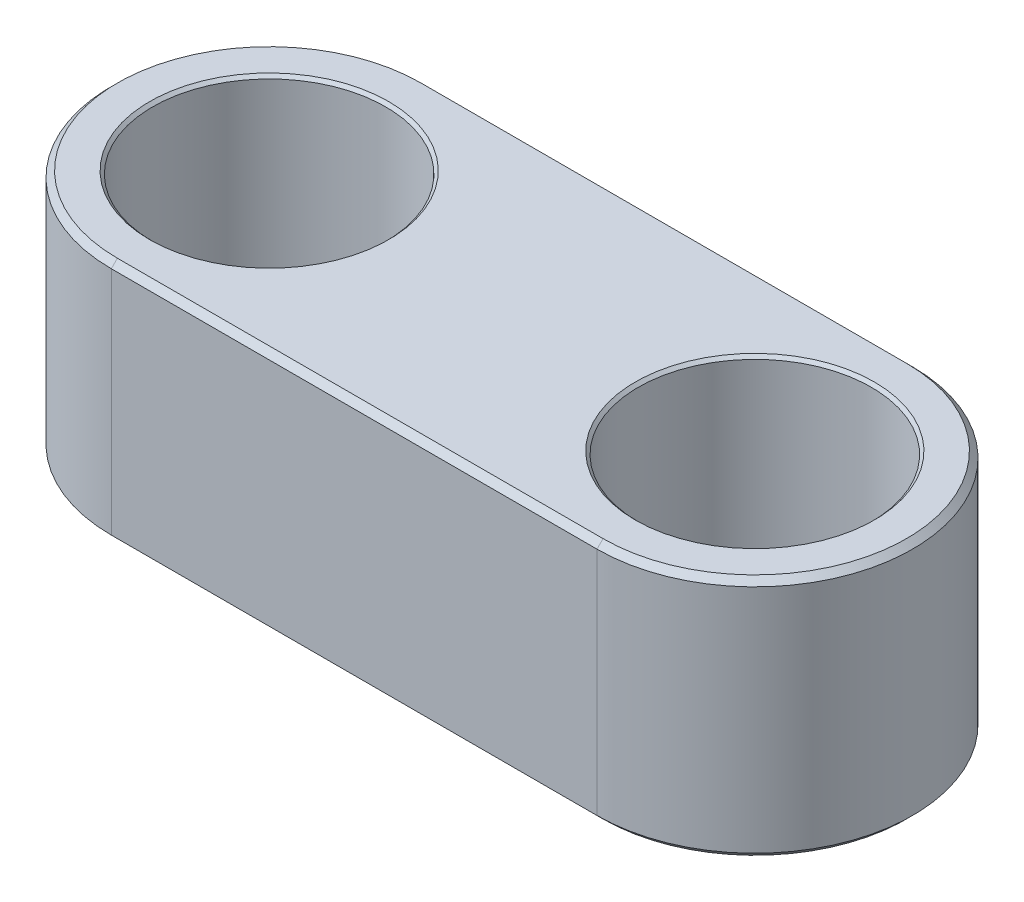
ISO-10303-21;
HEADER;
FILE_DESCRIPTION(('STEP AP214'),'2;1');
FILE_NAME('part.step','',(''),(''),'','','');
FILE_SCHEMA(('AUTOMOTIVE_DESIGN { 1 0 10303 214 1 1 1 1 }'));
ENDSEC;
DATA;
#1=APPLICATION_CONTEXT('core data for automotive mechanical design processes');
#2=APPLICATION_PROTOCOL_DEFINITION('international standard','automotive_design',2000,#1);
#3=PRODUCT_CONTEXT('',#1,'mechanical');
#4=PRODUCT('Part','Part','',(#3));
#5=PRODUCT_RELATED_PRODUCT_CATEGORY('part','',(#4));
#6=PRODUCT_DEFINITION_FORMATION('','',#4);
#7=PRODUCT_DEFINITION_CONTEXT('part definition',#1,'design');
#8=PRODUCT_DEFINITION('design','',#6,#7);
#9=PRODUCT_DEFINITION_SHAPE('','',#8);
#10=(LENGTH_UNIT() NAMED_UNIT(*) SI_UNIT(.MILLI.,.METRE.));
#11=(NAMED_UNIT(*) PLANE_ANGLE_UNIT() SI_UNIT($,.RADIAN.));
#12=(NAMED_UNIT(*) SI_UNIT($,.STERADIAN.) SOLID_ANGLE_UNIT());
#13=UNCERTAINTY_MEASURE_WITH_UNIT(LENGTH_MEASURE(1.E-05),#10,'distance_accuracy_value','');
#14=(GEOMETRIC_REPRESENTATION_CONTEXT(3) GLOBAL_UNCERTAINTY_ASSIGNED_CONTEXT((#13)) GLOBAL_UNIT_ASSIGNED_CONTEXT((#10,
#11,#12)) REPRESENTATION_CONTEXT('',''));
#15=CARTESIAN_POINT('',(0.,0.,0.));
#16=DIRECTION('',(0.,0.,1.));
#17=DIRECTION('',(1.,0.,0.));
#18=AXIS2_PLACEMENT_3D('',#15,#16,#17);
#19=CARTESIAN_POINT('',(0.,40.,0.));
#20=DIRECTION('',(0.,1.,0.));
#21=DIRECTION('',(0.,0.,1.));
#22=AXIS2_PLACEMENT_3D('',#19,#20,#21);
#23=PLANE('',#22);
#24=CARTESIAN_POINT('',(80.,40.,0.));
#25=DIRECTION('',(0.,1.,0.));
#26=DIRECTION('',(0.,0.,1.));
#27=AXIS2_PLACEMENT_3D('',#24,#25,#26);
#28=CIRCLE('',#27,19.7);
#29=CARTESIAN_POINT('',(80.,40.,19.7));
#30=VERTEX_POINT('',#29);
#31=EDGE_CURVE('E370',#30,#30,#28,.F.);
#32=ORIENTED_EDGE('',*,*,#31,.T.);
#33=EDGE_LOOP('',(#32));
#34=FACE_BOUND('',#33,.T.);
#35=CARTESIAN_POINT('',(0.,40.,0.));
#36=DIRECTION('',(0.,1.,0.));
#37=DIRECTION('',(0.,0.,1.));
#38=AXIS2_PLACEMENT_3D('',#35,#36,#37);
#39=CIRCLE('',#38,19.7);
#40=CARTESIAN_POINT('',(0.,40.,19.7));
#41=VERTEX_POINT('',#40);
#42=EDGE_CURVE('E367',#41,#41,#39,.F.);
#43=ORIENTED_EDGE('',*,*,#42,.T.);
#44=EDGE_LOOP('',(#43));
#45=FACE_BOUND('',#44,.T.);
#46=DIRECTION('',(-1.,0.,0.));
#47=VECTOR('',#46,1.);
#48=CARTESIAN_POINT('',(0.,40.,-25.));
#49=LINE('',#48,#47);
#50=CARTESIAN_POINT('',(80.,40.,-25.));
#51=VERTEX_POINT('',#50);
#52=CARTESIAN_POINT('',(0.,40.,-25.));
#53=VERTEX_POINT('',#52);
#54=EDGE_CURVE('E295',#51,#53,#49,.T.);
#55=ORIENTED_EDGE('',*,*,#54,.T.);
#56=CARTESIAN_POINT('',(0.,40.,0.));
#57=DIRECTION('',(0.,1.,0.));
#58=DIRECTION('',(0.,0.,1.));
#59=AXIS2_PLACEMENT_3D('',#56,#57,#58);
#60=CIRCLE('',#59,25.);
#61=CARTESIAN_POINT('',(0.,40.,25.));
#62=VERTEX_POINT('',#61);
#63=EDGE_CURVE('E291',#53,#62,#60,.T.);
#64=ORIENTED_EDGE('',*,*,#63,.T.);
#65=DIRECTION('',(1.,0.,0.));
#66=VECTOR('',#65,1.);
#67=CARTESIAN_POINT('',(80.,40.,25.));
#68=LINE('',#67,#66);
#69=CARTESIAN_POINT('',(80.,40.,25.));
#70=VERTEX_POINT('',#69);
#71=EDGE_CURVE('E293',#62,#70,#68,.T.);
#72=ORIENTED_EDGE('',*,*,#71,.T.);
#73=CARTESIAN_POINT('',(80.,40.,0.));
#74=DIRECTION('',(0.,1.,0.));
#75=DIRECTION('',(0.,0.,1.));
#76=AXIS2_PLACEMENT_3D('',#73,#74,#75);
#77=CIRCLE('',#76,25.);
#78=EDGE_CURVE('E297',#70,#51,#77,.T.);
#79=ORIENTED_EDGE('',*,*,#78,.T.);
#80=EDGE_LOOP('',(#55,#64,#72,#79));
#81=FACE_BOUND('',#80,.T.);
#82=ADVANCED_FACE('F36',(#34,#45,#81),#23,.T.);
#83=CARTESIAN_POINT('',(0.,0.,0.));
#84=DIRECTION('',(0.,1.,0.));
#85=DIRECTION('',(0.,0.,1.));
#86=AXIS2_PLACEMENT_3D('',#83,#84,#85);
#87=PLANE('',#86);
#88=CARTESIAN_POINT('',(80.,0.,0.));
#89=DIRECTION('',(0.,1.,0.));
#90=DIRECTION('',(0.,0.,1.));
#91=AXIS2_PLACEMENT_3D('',#88,#89,#90);
#92=CIRCLE('',#91,19.7);
#93=CARTESIAN_POINT('',(80.,0.,19.7));
#94=VERTEX_POINT('',#93);
#95=EDGE_CURVE('E376',#94,#94,#92,.T.);
#96=ORIENTED_EDGE('',*,*,#95,.T.);
#97=EDGE_LOOP('',(#96));
#98=FACE_BOUND('',#97,.T.);
#99=CARTESIAN_POINT('',(0.,0.,0.));
#100=DIRECTION('',(0.,1.,0.));
#101=DIRECTION('',(0.,0.,1.));
#102=AXIS2_PLACEMENT_3D('',#99,#100,#101);
#103=CIRCLE('',#102,19.7);
#104=CARTESIAN_POINT('',(0.,0.,19.7));
#105=VERTEX_POINT('',#104);
#106=EDGE_CURVE('E373',#105,#105,#103,.T.);
#107=ORIENTED_EDGE('',*,*,#106,.T.);
#108=EDGE_LOOP('',(#107));
#109=FACE_BOUND('',#108,.T.);
#110=DIRECTION('',(1.,0.,0.));
#111=VECTOR('',#110,1.);
#112=CARTESIAN_POINT('',(0.,0.,-25.));
#113=LINE('',#112,#111);
#114=CARTESIAN_POINT('',(0.,0.,-25.));
#115=VERTEX_POINT('',#114);
#116=CARTESIAN_POINT('',(80.,0.,-25.));
#117=VERTEX_POINT('',#116);
#118=EDGE_CURVE('E276',#115,#117,#113,.T.);
#119=ORIENTED_EDGE('',*,*,#118,.T.);
#120=CARTESIAN_POINT('',(80.,0.,0.));
#121=DIRECTION('',(0.,1.,0.));
#122=DIRECTION('',(0.,0.,1.));
#123=AXIS2_PLACEMENT_3D('',#120,#121,#122);
#124=CIRCLE('',#123,25.);
#125=CARTESIAN_POINT('',(80.,0.,25.));
#126=VERTEX_POINT('',#125);
#127=EDGE_CURVE('E272',#117,#126,#124,.F.);
#128=ORIENTED_EDGE('',*,*,#127,.T.);
#129=DIRECTION('',(-1.,0.,0.));
#130=VECTOR('',#129,1.);
#131=CARTESIAN_POINT('',(0.,0.,25.));
#132=LINE('',#131,#130);
#133=CARTESIAN_POINT('',(0.,0.,25.));
#134=VERTEX_POINT('',#133);
#135=EDGE_CURVE('E270',#126,#134,#132,.T.);
#136=ORIENTED_EDGE('',*,*,#135,.T.);
#137=CARTESIAN_POINT('',(0.,0.,0.));
#138=DIRECTION('',(0.,1.,0.));
#139=DIRECTION('',(0.,0.,1.));
#140=AXIS2_PLACEMENT_3D('',#137,#138,#139);
#141=CIRCLE('',#140,25.);
#142=EDGE_CURVE('E274',#134,#115,#141,.F.);
#143=ORIENTED_EDGE('',*,*,#142,.T.);
#144=EDGE_LOOP('',(#119,#128,#136,#143));
#145=FACE_BOUND('',#144,.T.);
#146=ADVANCED_FACE('F394',(#98,#109,#145),#87,.F.);
#147=CARTESIAN_POINT('',(0.,40.,0.));
#148=DIRECTION('',(0.,-1.,0.));
#149=DIRECTION('',(0.,0.,-1.));
#150=AXIS2_PLACEMENT_3D('',#147,#148,#149);
#151=CYLINDRICAL_SURFACE('',#150,26.);
#152=DIRECTION('',(0.,-1.,0.));
#153=VECTOR('',#152,1.);
#154=CARTESIAN_POINT('',(0.,40.,-26.));
#155=LINE('',#154,#153);
#156=CARTESIAN_POINT('',(0.,39.,-26.));
#157=VERTEX_POINT('',#156);
#158=CARTESIAN_POINT('',(0.,1.,-26.));
#159=VERTEX_POINT('',#158);
#160=EDGE_CURVE('E254',#157,#159,#155,.T.);
#161=ORIENTED_EDGE('',*,*,#160,.T.);
#162=CARTESIAN_POINT('',(0.,1.,0.));
#163=DIRECTION('',(0.,1.,0.));
#164=DIRECTION('',(0.,0.,1.));
#165=AXIS2_PLACEMENT_3D('',#162,#163,#164);
#166=CIRCLE('',#165,26.);
#167=CARTESIAN_POINT('',(0.,1.,26.));
#168=VERTEX_POINT('',#167);
#169=EDGE_CURVE('E280',#159,#168,#166,.T.);
#170=ORIENTED_EDGE('',*,*,#169,.T.);
#171=DIRECTION('',(0.,-1.,0.));
#172=VECTOR('',#171,1.);
#173=CARTESIAN_POINT('',(0.,40.,26.));
#174=LINE('',#173,#172);
#175=CARTESIAN_POINT('',(0.,39.,26.));
#176=VERTEX_POINT('',#175);
#177=EDGE_CURVE('E263',#176,#168,#174,.T.);
#178=ORIENTED_EDGE('',*,*,#177,.F.);
#179=CARTESIAN_POINT('',(0.,39.,0.));
#180=DIRECTION('',(0.,1.,0.));
#181=DIRECTION('',(0.,0.,1.));
#182=AXIS2_PLACEMENT_3D('',#179,#180,#181);
#183=CIRCLE('',#182,26.);
#184=EDGE_CURVE('E278',#176,#157,#183,.F.);
#185=ORIENTED_EDGE('',*,*,#184,.T.);
#186=EDGE_LOOP('',(#161,#170,#178,#185));
#187=FACE_BOUND('',#186,.T.);
#188=ADVANCED_FACE('F400',(#187),#151,.T.);
#189=CARTESIAN_POINT('',(0.,40.,26.));
#190=DIRECTION('',(0.,0.,-1.));
#191=DIRECTION('',(-1.,0.,0.));
#192=AXIS2_PLACEMENT_3D('',#189,#190,#191);
#193=PLANE('',#192);
#194=DIRECTION('',(-1.,0.,0.));
#195=VECTOR('',#194,1.);
#196=CARTESIAN_POINT('',(0.,39.,26.));
#197=LINE('',#196,#195);
#198=CARTESIAN_POINT('',(80.,39.,26.));
#199=VERTEX_POINT('',#198);
#200=EDGE_CURVE('E287',#199,#176,#197,.T.);
#201=ORIENTED_EDGE('',*,*,#200,.T.);
#202=ORIENTED_EDGE('',*,*,#177,.T.);
#203=DIRECTION('',(1.,0.,0.));
#204=VECTOR('',#203,1.);
#205=CARTESIAN_POINT('',(0.,1.,26.));
#206=LINE('',#205,#204);
#207=CARTESIAN_POINT('',(80.,1.,26.));
#208=VERTEX_POINT('',#207);
#209=EDGE_CURVE('E289',#168,#208,#206,.T.);
#210=ORIENTED_EDGE('',*,*,#209,.T.);
#211=DIRECTION('',(0.,-1.,0.));
#212=VECTOR('',#211,1.);
#213=CARTESIAN_POINT('',(80.,40.,26.));
#214=LINE('',#213,#212);
#215=EDGE_CURVE('E260',#199,#208,#214,.T.);
#216=ORIENTED_EDGE('',*,*,#215,.F.);
#217=EDGE_LOOP('',(#201,#202,#210,#216));
#218=FACE_BOUND('',#217,.T.);
#219=ADVANCED_FACE('F414',(#218),#193,.F.);
#220=CARTESIAN_POINT('',(80.,40.,0.));
#221=DIRECTION('',(0.,-1.,0.));
#222=DIRECTION('',(0.,0.,-1.));
#223=AXIS2_PLACEMENT_3D('',#220,#221,#222);
#224=CYLINDRICAL_SURFACE('',#223,26.);
#225=ORIENTED_EDGE('',*,*,#215,.T.);
#226=CARTESIAN_POINT('',(80.,1.,0.));
#227=DIRECTION('',(0.,1.,0.));
#228=DIRECTION('',(0.,0.,1.));
#229=AXIS2_PLACEMENT_3D('',#226,#227,#228);
#230=CIRCLE('',#229,26.);
#231=CARTESIAN_POINT('',(80.,1.,-26.));
#232=VERTEX_POINT('',#231);
#233=EDGE_CURVE('E285',#208,#232,#230,.T.);
#234=ORIENTED_EDGE('',*,*,#233,.T.);
#235=DIRECTION('',(0.,-1.,0.));
#236=VECTOR('',#235,1.);
#237=CARTESIAN_POINT('',(80.,40.,-26.));
#238=LINE('',#237,#236);
#239=CARTESIAN_POINT('',(80.,39.,-26.));
#240=VERTEX_POINT('',#239);
#241=EDGE_CURVE('E257',#240,#232,#238,.T.);
#242=ORIENTED_EDGE('',*,*,#241,.F.);
#243=CARTESIAN_POINT('',(80.,39.,0.));
#244=DIRECTION('',(0.,1.,0.));
#245=DIRECTION('',(0.,0.,1.));
#246=AXIS2_PLACEMENT_3D('',#243,#244,#245);
#247=CIRCLE('',#246,26.);
#248=EDGE_CURVE('E282',#240,#199,#247,.F.);
#249=ORIENTED_EDGE('',*,*,#248,.T.);
#250=EDGE_LOOP('',(#225,#234,#242,#249));
#251=FACE_BOUND('',#250,.T.);
#252=ADVANCED_FACE('F410',(#251),#224,.T.);
#253=CARTESIAN_POINT('',(0.,40.,-26.));
#254=DIRECTION('',(0.,0.,1.));
#255=DIRECTION('',(1.,0.,0.));
#256=AXIS2_PLACEMENT_3D('',#253,#254,#255);
#257=PLANE('',#256);
#258=DIRECTION('',(1.,0.,0.));
#259=VECTOR('',#258,1.);
#260=CARTESIAN_POINT('',(80.,39.,-26.));
#261=LINE('',#260,#259);
#262=EDGE_CURVE('E266',#157,#240,#261,.T.);
#263=ORIENTED_EDGE('',*,*,#262,.T.);
#264=ORIENTED_EDGE('',*,*,#241,.T.);
#265=DIRECTION('',(-1.,0.,0.));
#266=VECTOR('',#265,1.);
#267=CARTESIAN_POINT('',(0.,1.,-26.));
#268=LINE('',#267,#266);
#269=EDGE_CURVE('E268',#232,#159,#268,.T.);
#270=ORIENTED_EDGE('',*,*,#269,.T.);
#271=ORIENTED_EDGE('',*,*,#160,.F.);
#272=EDGE_LOOP('',(#263,#264,#270,#271));
#273=FACE_BOUND('',#272,.T.);
#274=ADVANCED_FACE('F407',(#273),#257,.F.);
#275=CARTESIAN_POINT('',(0.,40.,0.));
#276=DIRECTION('',(0.,-1.,0.));
#277=DIRECTION('',(0.,0.,-1.));
#278=AXIS2_PLACEMENT_3D('',#275,#276,#277);
#279=CYLINDRICAL_SURFACE('',#278,19.2);
#280=CARTESIAN_POINT('',(0.,0.500000000000007,0.));
#281=DIRECTION('',(0.,1.,0.));
#282=DIRECTION('',(0.,0.,1.));
#283=AXIS2_PLACEMENT_3D('',#280,#281,#282);
#284=CIRCLE('',#283,19.2);
#285=CARTESIAN_POINT('',(0.,0.500000000000007,19.2));
#286=VERTEX_POINT('',#285);
#287=EDGE_CURVE('E11',#286,#286,#284,.F.);
#288=ORIENTED_EDGE('',*,*,#287,.T.);
#289=EDGE_LOOP('',(#288));
#290=FACE_BOUND('',#289,.T.);
#291=CARTESIAN_POINT('',(0.,39.5,0.));
#292=DIRECTION('',(0.,1.,0.));
#293=DIRECTION('',(0.,0.,1.));
#294=AXIS2_PLACEMENT_3D('',#291,#292,#293);
#295=CIRCLE('',#294,19.2);
#296=CARTESIAN_POINT('',(0.,39.5,19.2));
#297=VERTEX_POINT('',#296);
#298=EDGE_CURVE('E46',#297,#297,#295,.T.);
#299=ORIENTED_EDGE('',*,*,#298,.T.);
#300=EDGE_LOOP('',(#299));
#301=FACE_BOUND('',#300,.T.);
#302=ADVANCED_FACE('F381',(#290,#301),#279,.F.);
#303=CARTESIAN_POINT('',(80.,40.,0.));
#304=DIRECTION('',(0.,-1.,0.));
#305=DIRECTION('',(0.,0.,-1.));
#306=AXIS2_PLACEMENT_3D('',#303,#304,#305);
#307=CYLINDRICAL_SURFACE('',#306,19.2);
#308=CARTESIAN_POINT('',(80.,39.5,0.));
#309=DIRECTION('',(0.,1.,0.));
#310=DIRECTION('',(0.,0.,1.));
#311=AXIS2_PLACEMENT_3D('',#308,#309,#310);
#312=CIRCLE('',#311,19.2);
#313=CARTESIAN_POINT('',(80.,39.5,19.2));
#314=VERTEX_POINT('',#313);
#315=EDGE_CURVE('E364',#314,#314,#312,.T.);
#316=ORIENTED_EDGE('',*,*,#315,.T.);
#317=EDGE_LOOP('',(#316));
#318=FACE_BOUND('',#317,.T.);
#319=CARTESIAN_POINT('',(80.,0.499999999999987,0.));
#320=DIRECTION('',(0.,1.,0.));
#321=DIRECTION('',(0.,0.,1.));
#322=AXIS2_PLACEMENT_3D('',#319,#320,#321);
#323=CIRCLE('',#322,19.2);
#324=CARTESIAN_POINT('',(80.,0.499999999999987,19.2));
#325=VERTEX_POINT('',#324);
#326=EDGE_CURVE('E361',#325,#325,#323,.F.);
#327=ORIENTED_EDGE('',*,*,#326,.T.);
#328=EDGE_LOOP('',(#327));
#329=FACE_BOUND('',#328,.T.);
#330=ADVANCED_FACE('F451',(#318,#329),#307,.F.);
#331=CARTESIAN_POINT('',(0.,1.,26.));
#332=DIRECTION('',(0.,0.707106781186547,-0.707106781186547));
#333=DIRECTION('',(1.,0.,0.));
#334=AXIS2_PLACEMENT_3D('',#331,#332,#333);
#335=PLANE('',#334);
#336=DIRECTION('',(0.,-0.707106781186547,-0.707106781186547));
#337=VECTOR('',#336,1.);
#338=CARTESIAN_POINT('',(80.,1.,26.));
#339=LINE('',#338,#337);
#340=EDGE_CURVE('E253',#208,#126,#339,.T.);
#341=ORIENTED_EDGE('',*,*,#340,.F.);
#342=ORIENTED_EDGE('',*,*,#209,.F.);
#343=DIRECTION('',(0.,0.707106781186547,0.707106781186547));
#344=VECTOR('',#343,1.);
#345=CARTESIAN_POINT('',(0.,0.,25.));
#346=LINE('',#345,#344);
#347=EDGE_CURVE('E308',#134,#168,#346,.T.);
#348=ORIENTED_EDGE('',*,*,#347,.F.);
#349=ORIENTED_EDGE('',*,*,#135,.F.);
#350=EDGE_LOOP('',(#341,#342,#348,#349));
#351=FACE_BOUND('',#350,.T.);
#352=ADVANCED_FACE('F445',(#351),#335,.F.);
#353=CARTESIAN_POINT('',(80.,1.,0.));
#354=DIRECTION('',(0.,1.,0.));
#355=DIRECTION('',(0.,0.,1.));
#356=AXIS2_PLACEMENT_3D('',#353,#354,#355);
#357=CONICAL_SURFACE('',#356,26.,0.785398163397448);
#358=ORIENTED_EDGE('',*,*,#340,.T.);
#359=ORIENTED_EDGE('',*,*,#127,.F.);
#360=DIRECTION('',(0.,-0.707106781186547,0.707106781186547));
#361=VECTOR('',#360,1.);
#362=CARTESIAN_POINT('',(80.,1.,-26.));
#363=LINE('',#362,#361);
#364=EDGE_CURVE('E304',#232,#117,#363,.T.);
#365=ORIENTED_EDGE('',*,*,#364,.F.);
#366=ORIENTED_EDGE('',*,*,#233,.F.);
#367=EDGE_LOOP('',(#358,#359,#365,#366));
#368=FACE_BOUND('',#367,.T.);
#369=ADVANCED_FACE('F438',(#368),#357,.T.);
#370=CARTESIAN_POINT('',(0.,1.,0.));
#371=DIRECTION('',(0.,1.,0.));
#372=DIRECTION('',(0.,0.,1.));
#373=AXIS2_PLACEMENT_3D('',#370,#371,#372);
#374=CONICAL_SURFACE('',#373,26.,0.785398163397448);
#375=ORIENTED_EDGE('',*,*,#347,.T.);
#376=ORIENTED_EDGE('',*,*,#169,.F.);
#377=DIRECTION('',(0.,0.707106781186547,-0.707106781186547));
#378=VECTOR('',#377,1.);
#379=CARTESIAN_POINT('',(0.,0.,-25.));
#380=LINE('',#379,#378);
#381=EDGE_CURVE('E301',#115,#159,#380,.T.);
#382=ORIENTED_EDGE('',*,*,#381,.F.);
#383=ORIENTED_EDGE('',*,*,#142,.F.);
#384=EDGE_LOOP('',(#375,#376,#382,#383));
#385=FACE_BOUND('',#384,.T.);
#386=ADVANCED_FACE('F431',(#385),#374,.T.);
#387=CARTESIAN_POINT('',(0.,1.,-26.));
#388=DIRECTION('',(0.,0.707106781186547,0.707106781186547));
#389=DIRECTION('',(-1.,0.,0.));
#390=AXIS2_PLACEMENT_3D('',#387,#388,#389);
#391=PLANE('',#390);
#392=ORIENTED_EDGE('',*,*,#381,.T.);
#393=ORIENTED_EDGE('',*,*,#269,.F.);
#394=ORIENTED_EDGE('',*,*,#364,.T.);
#395=ORIENTED_EDGE('',*,*,#118,.F.);
#396=EDGE_LOOP('',(#392,#393,#394,#395));
#397=FACE_BOUND('',#396,.T.);
#398=ADVANCED_FACE('F423',(#397),#391,.F.);
#399=CARTESIAN_POINT('',(0.,40.,0.));
#400=DIRECTION('',(0.,-1.,0.));
#401=DIRECTION('',(0.,0.,-1.));
#402=AXIS2_PLACEMENT_3D('',#399,#400,#401);
#403=CONICAL_SURFACE('',#402,25.,0.785398163397447);
#404=DIRECTION('',(0.,0.707106781186549,0.707106781186546));
#405=VECTOR('',#404,1.);
#406=CARTESIAN_POINT('',(0.,39.,-26.));
#407=LINE('',#406,#405);
#408=EDGE_CURVE('E316',#157,#53,#407,.T.);
#409=ORIENTED_EDGE('',*,*,#408,.F.);
#410=ORIENTED_EDGE('',*,*,#184,.F.);
#411=DIRECTION('',(0.,-0.707106781186549,0.707106781186546));
#412=VECTOR('',#411,1.);
#413=CARTESIAN_POINT('',(0.,40.,25.));
#414=LINE('',#413,#412);
#415=EDGE_CURVE('E305',#62,#176,#414,.T.);
#416=ORIENTED_EDGE('',*,*,#415,.F.);
#417=ORIENTED_EDGE('',*,*,#63,.F.);
#418=EDGE_LOOP('',(#409,#410,#416,#417));
#419=FACE_BOUND('',#418,.T.);
#420=ADVANCED_FACE('F430',(#419),#403,.T.);
#421=CARTESIAN_POINT('',(0.,40.,25.));
#422=DIRECTION('',(0.,0.707106781186546,0.707106781186549));
#423=DIRECTION('',(-1.,0.,0.));
#424=AXIS2_PLACEMENT_3D('',#421,#422,#423);
#425=PLANE('',#424);
#426=DIRECTION('',(0.,-0.707106781186549,0.707106781186546));
#427=VECTOR('',#426,1.);
#428=CARTESIAN_POINT('',(80.,40.,25.));
#429=LINE('',#428,#427);
#430=EDGE_CURVE('E314',#70,#199,#429,.T.);
#431=ORIENTED_EDGE('',*,*,#430,.F.);
#432=ORIENTED_EDGE('',*,*,#71,.F.);
#433=ORIENTED_EDGE('',*,*,#415,.T.);
#434=ORIENTED_EDGE('',*,*,#200,.F.);
#435=EDGE_LOOP('',(#431,#432,#433,#434));
#436=FACE_BOUND('',#435,.T.);
#437=ADVANCED_FACE('F469',(#436),#425,.T.);
#438=CARTESIAN_POINT('',(0.,40.,-25.));
#439=DIRECTION('',(0.,0.707106781186546,-0.707106781186549));
#440=DIRECTION('',(1.,0.,0.));
#441=AXIS2_PLACEMENT_3D('',#438,#439,#440);
#442=PLANE('',#441);
#443=ORIENTED_EDGE('',*,*,#408,.T.);
#444=ORIENTED_EDGE('',*,*,#54,.F.);
#445=DIRECTION('',(0.,0.707106781186549,0.707106781186546));
#446=VECTOR('',#445,1.);
#447=CARTESIAN_POINT('',(80.,39.,-26.));
#448=LINE('',#447,#446);
#449=EDGE_CURVE('E239',#240,#51,#448,.T.);
#450=ORIENTED_EDGE('',*,*,#449,.F.);
#451=ORIENTED_EDGE('',*,*,#262,.F.);
#452=EDGE_LOOP('',(#443,#444,#450,#451));
#453=FACE_BOUND('',#452,.T.);
#454=ADVANCED_FACE('F462',(#453),#442,.T.);
#455=CARTESIAN_POINT('',(80.,40.,0.));
#456=DIRECTION('',(0.,-1.,0.));
#457=DIRECTION('',(0.,0.,-1.));
#458=AXIS2_PLACEMENT_3D('',#455,#456,#457);
#459=CONICAL_SURFACE('',#458,25.,0.785398163397447);
#460=ORIENTED_EDGE('',*,*,#430,.T.);
#461=ORIENTED_EDGE('',*,*,#248,.F.);
#462=ORIENTED_EDGE('',*,*,#449,.T.);
#463=ORIENTED_EDGE('',*,*,#78,.F.);
#464=EDGE_LOOP('',(#460,#461,#462,#463));
#465=FACE_BOUND('',#464,.T.);
#466=ADVANCED_FACE('F454',(#465),#459,.T.);
#467=CARTESIAN_POINT('',(80.,39.5,0.));
#468=DIRECTION('',(0.,1.,0.));
#469=DIRECTION('',(0.,0.,1.));
#470=AXIS2_PLACEMENT_3D('',#467,#468,#469);
#471=CONICAL_SURFACE('',#470,19.2,0.785398163397445);
#472=ORIENTED_EDGE('',*,*,#31,.F.);
#473=EDGE_LOOP('',(#472));
#474=FACE_BOUND('',#473,.T.);
#475=ORIENTED_EDGE('',*,*,#315,.F.);
#476=EDGE_LOOP('',(#475));
#477=FACE_BOUND('',#476,.T.);
#478=ADVANCED_FACE('F461',(#474,#477),#471,.F.);
#479=CARTESIAN_POINT('',(80.,0.,0.));
#480=DIRECTION('',(0.,-1.,0.));
#481=DIRECTION('',(0.,0.,-1.));
#482=AXIS2_PLACEMENT_3D('',#479,#480,#481);
#483=CONICAL_SURFACE('',#482,19.7,0.785398163397452);
#484=ORIENTED_EDGE('',*,*,#326,.F.);
#485=EDGE_LOOP('',(#484));
#486=FACE_BOUND('',#485,.T.);
#487=ORIENTED_EDGE('',*,*,#95,.F.);
#488=EDGE_LOOP('',(#487));
#489=FACE_BOUND('',#488,.T.);
#490=ADVANCED_FACE('F390',(#486,#489),#483,.F.);
#491=CARTESIAN_POINT('',(0.,0.,0.));
#492=DIRECTION('',(0.,-1.,0.));
#493=DIRECTION('',(0.,0.,-1.));
#494=AXIS2_PLACEMENT_3D('',#491,#492,#493);
#495=CONICAL_SURFACE('',#494,19.7,0.785398163397438);
#496=ORIENTED_EDGE('',*,*,#287,.F.);
#497=EDGE_LOOP('',(#496));
#498=FACE_BOUND('',#497,.T.);
#499=ORIENTED_EDGE('',*,*,#106,.F.);
#500=EDGE_LOOP('',(#499));
#501=FACE_BOUND('',#500,.T.);
#502=ADVANCED_FACE('F384',(#498,#501),#495,.F.);
#503=CARTESIAN_POINT('',(0.,39.5,0.));
#504=DIRECTION('',(0.,1.,0.));
#505=DIRECTION('',(0.,0.,1.));
#506=AXIS2_PLACEMENT_3D('',#503,#504,#505);
#507=CONICAL_SURFACE('',#506,19.2,0.785398163397445);
#508=ORIENTED_EDGE('',*,*,#42,.F.);
#509=EDGE_LOOP('',(#508));
#510=FACE_BOUND('',#509,.T.);
#511=ORIENTED_EDGE('',*,*,#298,.F.);
#512=EDGE_LOOP('',(#511));
#513=FACE_BOUND('',#512,.T.);
#514=ADVANCED_FACE('F39',(#510,#513),#507,.F.);
#515=CLOSED_SHELL('',(#82,#146,#188,#219,#252,#274,#302,#330,#352,#369,#386,#398,#420,#437,#454,
#466,#478,#490,#502,#514));
#516=CARTESIAN_POINT('',(80.,37.,0.));
#517=DIRECTION('',(0.,1.,0.));
#518=DIRECTION('',(0.,0.,1.));
#519=AXIS2_PLACEMENT_3D('',#516,#517,#518);
#520=PLANE('',#519);
#521=DIRECTION('',(0.,0.,-1.));
#522=VECTOR('',#521,1.);
#523=CARTESIAN_POINT('',(37.,37.,-15.5520682838068));
#524=LINE('',#523,#522);
#525=CARTESIAN_POINT('',(37.,37.,19.));
#526=VERTEX_POINT('',#525);
#527=CARTESIAN_POINT('',(37.,37.,-19.));
#528=VERTEX_POINT('',#527);
#529=EDGE_CURVE('E229',#526,#528,#524,.T.);
#530=ORIENTED_EDGE('',*,*,#529,.F.);
#531=CARTESIAN_POINT('',(36.,37.,19.));
#532=DIRECTION('',(0.,1.,0.));
#533=DIRECTION('',(0.,0.,1.));
#534=AXIS2_PLACEMENT_3D('',#531,#532,#533);
#535=CIRCLE('',#534,1.);
#536=CARTESIAN_POINT('',(36.,37.,20.));
#537=VERTEX_POINT('',#536);
#538=EDGE_CURVE('E231',#526,#537,#535,.F.);
#539=ORIENTED_EDGE('',*,*,#538,.T.);
#540=DIRECTION('',(1.,0.,0.));
#541=VECTOR('',#540,1.);
#542=CARTESIAN_POINT('',(18.0399556540475,37.,20.));
#543=LINE('',#542,#541);
#544=CARTESIAN_POINT('',(18.0399556540475,37.,20.));
#545=VERTEX_POINT('',#544);
#546=EDGE_CURVE('E222',#545,#537,#543,.T.);
#547=ORIENTED_EDGE('',*,*,#546,.F.);
#548=CARTESIAN_POINT('',(18.0399556540475,37.,19.));
#549=DIRECTION('',(0.,1.,0.));
#550=DIRECTION('',(0.,0.,1.));
#551=AXIS2_PLACEMENT_3D('',#548,#549,#550);
#552=CIRCLE('',#551,1.);
#553=CARTESIAN_POINT('',(17.3514077283205,37.,18.2748091603053));
#554=VERTEX_POINT('',#553);
#555=EDGE_CURVE('E219',#554,#545,#552,.T.);
#556=ORIENTED_EDGE('',*,*,#555,.F.);
#557=CARTESIAN_POINT('',(0.,37.,0.));
#558=DIRECTION('',(0.,-1.,0.));
#559=DIRECTION('',(0.,0.,1.));
#560=AXIS2_PLACEMENT_3D('',#557,#558,#559);
#561=CIRCLE('',#560,25.2);
#562=CARTESIAN_POINT('',(17.3514077283205,37.,-18.2748091603053));
#563=VERTEX_POINT('',#562);
#564=EDGE_CURVE('E217',#563,#554,#561,.T.);
#565=ORIENTED_EDGE('',*,*,#564,.F.);
#566=CARTESIAN_POINT('',(18.0399556540475,37.,-19.));
#567=DIRECTION('',(0.,1.,0.));
#568=DIRECTION('',(0.,0.,1.));
#569=AXIS2_PLACEMENT_3D('',#566,#567,#568);
#570=CIRCLE('',#569,1.);
#571=CARTESIAN_POINT('',(18.0399556540475,37.,-20.));
#572=VERTEX_POINT('',#571);
#573=EDGE_CURVE('E215',#572,#563,#570,.T.);
#574=ORIENTED_EDGE('',*,*,#573,.F.);
#575=DIRECTION('',(-1.,0.,0.));
#576=VECTOR('',#575,1.);
#577=CARTESIAN_POINT('',(18.0399556540475,37.,-20.));
#578=LINE('',#577,#576);
#579=CARTESIAN_POINT('',(36.,37.,-20.));
#580=VERTEX_POINT('',#579);
#581=EDGE_CURVE('E210',#580,#572,#578,.T.);
#582=ORIENTED_EDGE('',*,*,#581,.F.);
#583=CARTESIAN_POINT('',(36.,37.,-19.));
#584=DIRECTION('',(0.,1.,0.));
#585=DIRECTION('',(0.,0.,1.));
#586=AXIS2_PLACEMENT_3D('',#583,#584,#585);
#587=CIRCLE('',#586,1.);
#588=EDGE_CURVE('E226',#580,#528,#587,.F.);
#589=ORIENTED_EDGE('',*,*,#588,.T.);
#590=EDGE_LOOP('',(#530,#539,#547,#556,#565,#574,#582,#589));
#591=FACE_BOUND('',#590,.T.);
#592=ADVANCED_FACE('F588',(#591),#520,.F.);
#593=CARTESIAN_POINT('',(0.,6.,0.));
#594=DIRECTION('',(0.,1.,0.));
#595=DIRECTION('',(0.,0.,1.));
#596=AXIS2_PLACEMENT_3D('',#593,#594,#595);
#597=PLANE('',#596);
#598=DIRECTION('',(1.,0.,0.));
#599=VECTOR('',#598,1.);
#600=CARTESIAN_POINT('',(0.,6.,20.));
#601=LINE('',#600,#599);
#602=CARTESIAN_POINT('',(18.0399556540475,6.,20.));
#603=VERTEX_POINT('',#602);
#604=CARTESIAN_POINT('',(36.,6.,20.));
#605=VERTEX_POINT('',#604);
#606=EDGE_CURVE('E244',#603,#605,#601,.T.);
#607=ORIENTED_EDGE('',*,*,#606,.T.);
#608=CARTESIAN_POINT('',(36.,6.,19.));
#609=DIRECTION('',(0.,1.,0.));
#610=DIRECTION('',(0.,0.,1.));
#611=AXIS2_PLACEMENT_3D('',#608,#609,#610);
#612=CIRCLE('',#611,1.);
#613=CARTESIAN_POINT('',(37.,6.,19.));
#614=VERTEX_POINT('',#613);
#615=EDGE_CURVE('E344',#605,#614,#612,.T.);
#616=ORIENTED_EDGE('',*,*,#615,.T.);
#617=DIRECTION('',(0.,0.,-1.));
#618=VECTOR('',#617,1.);
#619=CARTESIAN_POINT('',(37.,6.,0.));
#620=LINE('',#619,#618);
#621=CARTESIAN_POINT('',(37.,6.,-19.));
#622=VERTEX_POINT('',#621);
#623=EDGE_CURVE('E300',#614,#622,#620,.T.);
#624=ORIENTED_EDGE('',*,*,#623,.T.);
#625=CARTESIAN_POINT('',(36.,6.,-19.));
#626=DIRECTION('',(0.,1.,0.));
#627=DIRECTION('',(0.,0.,1.));
#628=AXIS2_PLACEMENT_3D('',#625,#626,#627);
#629=CIRCLE('',#628,1.);
#630=CARTESIAN_POINT('',(36.,6.,-20.));
#631=VERTEX_POINT('',#630);
#632=EDGE_CURVE('E342',#622,#631,#629,.T.);
#633=ORIENTED_EDGE('',*,*,#632,.T.);
#634=DIRECTION('',(-1.,0.,0.));
#635=VECTOR('',#634,1.);
#636=CARTESIAN_POINT('',(0.,6.,-20.));
#637=LINE('',#636,#635);
#638=CARTESIAN_POINT('',(18.0399556540475,6.,-20.));
#639=VERTEX_POINT('',#638);
#640=EDGE_CURVE('E240',#631,#639,#637,.T.);
#641=ORIENTED_EDGE('',*,*,#640,.T.);
#642=CARTESIAN_POINT('',(18.0399556540475,6.,-19.));
#643=DIRECTION('',(0.,1.,0.));
#644=DIRECTION('',(0.,0.,1.));
#645=AXIS2_PLACEMENT_3D('',#642,#643,#644);
#646=CIRCLE('',#645,1.);
#647=CARTESIAN_POINT('',(17.3514077283205,6.,-18.2748091603053));
#648=VERTEX_POINT('',#647);
#649=EDGE_CURVE('E338',#639,#648,#646,.T.);
#650=ORIENTED_EDGE('',*,*,#649,.T.);
#651=CARTESIAN_POINT('',(0.,6.,0.));
#652=DIRECTION('',(0.,1.,0.));
#653=DIRECTION('',(0.,0.,1.));
#654=AXIS2_PLACEMENT_3D('',#651,#652,#653);
#655=CIRCLE('',#654,25.2);
#656=CARTESIAN_POINT('',(17.3514077283205,6.,18.2748091603053));
#657=VERTEX_POINT('',#656);
#658=EDGE_CURVE('E248',#657,#648,#655,.T.);
#659=ORIENTED_EDGE('',*,*,#658,.F.);
#660=CARTESIAN_POINT('',(18.0399556540475,6.,19.));
#661=DIRECTION('',(0.,1.,0.));
#662=DIRECTION('',(0.,0.,1.));
#663=AXIS2_PLACEMENT_3D('',#660,#661,#662);
#664=CIRCLE('',#663,1.);
#665=EDGE_CURVE('E340',#657,#603,#664,.T.);
#666=ORIENTED_EDGE('',*,*,#665,.T.);
#667=EDGE_LOOP('',(#607,#616,#624,#633,#641,#650,#659,#666));
#668=FACE_BOUND('',#667,.T.);
#669=ADVANCED_FACE('F508',(#668),#597,.T.);
#670=CARTESIAN_POINT('',(18.0399556540475,40.,-19.));
#671=DIRECTION('',(0.,-1.,0.));
#672=DIRECTION('',(0.,0.,-1.));
#673=AXIS2_PLACEMENT_3D('',#670,#671,#672);
#674=CYLINDRICAL_SURFACE('',#673,1.);
#675=ORIENTED_EDGE('',*,*,#573,.T.);
#676=DIRECTION('',(0.,-1.,0.));
#677=VECTOR('',#676,1.);
#678=CARTESIAN_POINT('',(17.3514077283205,40.,-18.2748091603053));
#679=LINE('',#678,#677);
#680=EDGE_CURVE('E356',#648,#563,#679,.F.);
#681=ORIENTED_EDGE('',*,*,#680,.F.);
#682=ORIENTED_EDGE('',*,*,#649,.F.);
#683=DIRECTION('',(0.,-1.,0.));
#684=VECTOR('',#683,1.);
#685=CARTESIAN_POINT('',(18.0399556540475,40.,-20.));
#686=LINE('',#685,#684);
#687=EDGE_CURVE('E351',#572,#639,#686,.T.);
#688=ORIENTED_EDGE('',*,*,#687,.F.);
#689=EDGE_LOOP('',(#675,#681,#682,#688));
#690=FACE_BOUND('',#689,.T.);
#691=ADVANCED_FACE('F504',(#690),#674,.F.);
#692=CARTESIAN_POINT('',(18.0399556540475,40.,19.));
#693=DIRECTION('',(0.,-1.,0.));
#694=DIRECTION('',(0.,0.,-1.));
#695=AXIS2_PLACEMENT_3D('',#692,#693,#694);
#696=CYLINDRICAL_SURFACE('',#695,1.);
#697=ORIENTED_EDGE('',*,*,#555,.T.);
#698=DIRECTION('',(0.,-1.,0.));
#699=VECTOR('',#698,1.);
#700=CARTESIAN_POINT('',(18.0399556540475,40.,20.));
#701=LINE('',#700,#699);
#702=EDGE_CURVE('E333',#603,#545,#701,.F.);
#703=ORIENTED_EDGE('',*,*,#702,.F.);
#704=ORIENTED_EDGE('',*,*,#665,.F.);
#705=DIRECTION('',(0.,-1.,0.));
#706=VECTOR('',#705,1.);
#707=CARTESIAN_POINT('',(17.3514077283205,40.,18.2748091603053));
#708=LINE('',#707,#706);
#709=EDGE_CURVE('E359',#554,#657,#708,.T.);
#710=ORIENTED_EDGE('',*,*,#709,.F.);
#711=EDGE_LOOP('',(#697,#703,#704,#710));
#712=FACE_BOUND('',#711,.T.);
#713=ADVANCED_FACE('F501',(#712),#696,.F.);
#714=CARTESIAN_POINT('',(0.,40.,0.));
#715=DIRECTION('',(0.,-1.,0.));
#716=DIRECTION('',(0.,0.,-1.));
#717=AXIS2_PLACEMENT_3D('',#714,#715,#716);
#718=CYLINDRICAL_SURFACE('',#717,25.2);
#719=ORIENTED_EDGE('',*,*,#564,.T.);
#720=ORIENTED_EDGE('',*,*,#709,.T.);
#721=ORIENTED_EDGE('',*,*,#658,.T.);
#722=ORIENTED_EDGE('',*,*,#680,.T.);
#723=EDGE_LOOP('',(#719,#720,#721,#722));
#724=FACE_BOUND('',#723,.T.);
#725=ADVANCED_FACE('F499',(#724),#718,.T.);
#726=CARTESIAN_POINT('',(36.,40.,-19.));
#727=DIRECTION('',(0.,1.,0.));
#728=DIRECTION('',(0.,0.,1.));
#729=AXIS2_PLACEMENT_3D('',#726,#727,#728);
#730=CYLINDRICAL_SURFACE('',#729,1.);
#731=ORIENTED_EDGE('',*,*,#588,.F.);
#732=DIRECTION('',(0.,-1.,0.));
#733=VECTOR('',#732,1.);
#734=CARTESIAN_POINT('',(36.,40.,-20.));
#735=LINE('',#734,#733);
#736=EDGE_CURVE('E353',#631,#580,#735,.F.);
#737=ORIENTED_EDGE('',*,*,#736,.F.);
#738=ORIENTED_EDGE('',*,*,#632,.F.);
#739=DIRECTION('',(0.,-1.,0.));
#740=VECTOR('',#739,1.);
#741=CARTESIAN_POINT('',(37.,6.,-19.));
#742=LINE('',#741,#740);
#743=EDGE_CURVE('E346',#528,#622,#742,.T.);
#744=ORIENTED_EDGE('',*,*,#743,.F.);
#745=EDGE_LOOP('',(#731,#737,#738,#744));
#746=FACE_BOUND('',#745,.T.);
#747=ADVANCED_FACE('F494',(#746),#730,.F.);
#748=CARTESIAN_POINT('',(36.,40.,19.));
#749=DIRECTION('',(0.,1.,0.));
#750=DIRECTION('',(0.,0.,1.));
#751=AXIS2_PLACEMENT_3D('',#748,#749,#750);
#752=CYLINDRICAL_SURFACE('',#751,1.);
#753=ORIENTED_EDGE('',*,*,#538,.F.);
#754=DIRECTION('',(0.,-1.,0.));
#755=VECTOR('',#754,1.);
#756=CARTESIAN_POINT('',(37.,40.,19.));
#757=LINE('',#756,#755);
#758=EDGE_CURVE('E348',#614,#526,#757,.F.);
#759=ORIENTED_EDGE('',*,*,#758,.F.);
#760=ORIENTED_EDGE('',*,*,#615,.F.);
#761=DIRECTION('',(0.,-1.,0.));
#762=VECTOR('',#761,1.);
#763=CARTESIAN_POINT('',(36.,6.,20.));
#764=LINE('',#763,#762);
#765=EDGE_CURVE('E336',#537,#605,#764,.T.);
#766=ORIENTED_EDGE('',*,*,#765,.F.);
#767=EDGE_LOOP('',(#753,#759,#760,#766));
#768=FACE_BOUND('',#767,.T.);
#769=ADVANCED_FACE('F490',(#768),#752,.F.);
#770=CARTESIAN_POINT('',(37.,40.,-15.5520682838068));
#771=DIRECTION('',(-1.,0.,0.));
#772=DIRECTION('',(0.,0.,1.));
#773=AXIS2_PLACEMENT_3D('',#770,#771,#772);
#774=PLANE('',#773);
#775=ORIENTED_EDGE('',*,*,#758,.T.);
#776=ORIENTED_EDGE('',*,*,#529,.T.);
#777=ORIENTED_EDGE('',*,*,#743,.T.);
#778=ORIENTED_EDGE('',*,*,#623,.F.);
#779=EDGE_LOOP('',(#775,#776,#777,#778));
#780=FACE_BOUND('',#779,.T.);
#781=ADVANCED_FACE('F493',(#780),#774,.T.);
#782=CARTESIAN_POINT('',(0.,40.,-20.));
#783=DIRECTION('',(0.,0.,1.));
#784=DIRECTION('',(1.,0.,0.));
#785=AXIS2_PLACEMENT_3D('',#782,#783,#784);
#786=PLANE('',#785);
#787=ORIENTED_EDGE('',*,*,#736,.T.);
#788=ORIENTED_EDGE('',*,*,#581,.T.);
#789=ORIENTED_EDGE('',*,*,#687,.T.);
#790=ORIENTED_EDGE('',*,*,#640,.F.);
#791=EDGE_LOOP('',(#787,#788,#789,#790));
#792=FACE_BOUND('',#791,.T.);
#793=ADVANCED_FACE('F581',(#792),#786,.T.);
#794=CARTESIAN_POINT('',(0.,40.,20.));
#795=DIRECTION('',(0.,0.,-1.));
#796=DIRECTION('',(-1.,0.,0.));
#797=AXIS2_PLACEMENT_3D('',#794,#795,#796);
#798=PLANE('',#797);
#799=ORIENTED_EDGE('',*,*,#702,.T.);
#800=ORIENTED_EDGE('',*,*,#546,.T.);
#801=ORIENTED_EDGE('',*,*,#765,.T.);
#802=ORIENTED_EDGE('',*,*,#606,.F.);
#803=EDGE_LOOP('',(#799,#800,#801,#802));
#804=FACE_BOUND('',#803,.T.);
#805=ADVANCED_FACE('F582',(#804),#798,.T.);
#806=CLOSED_SHELL('',(#592,#669,#691,#713,#725,#747,#769,#781,#793,#805));
#807=CARTESIAN_POINT('',(43.,37.,20.));
#808=VERTEX_POINT('',#807);
#809=CARTESIAN_POINT('',(61.9600443459525,37.,20.));
#810=VERTEX_POINT('',#809);
#811=EDGE_CURVE('E221',#808,#810,#543,.T.);
#812=ORIENTED_EDGE('',*,*,#811,.F.);
#813=DIRECTION('',(0.,0.,-1.));
#814=VECTOR('',#813,1.);
#815=CARTESIAN_POINT('',(43.,37.,-15.5520682838068));
#816=LINE('',#815,#814);
#817=CARTESIAN_POINT('',(43.,37.,-20.));
#818=VERTEX_POINT('',#817);
#819=EDGE_CURVE('E53',#808,#818,#816,.T.);
#820=ORIENTED_EDGE('',*,*,#819,.T.);
#821=CARTESIAN_POINT('',(61.9600443459525,37.,-20.));
#822=VERTEX_POINT('',#821);
#823=EDGE_CURVE('E61',#822,#818,#578,.T.);
#824=ORIENTED_EDGE('',*,*,#823,.F.);
#825=CARTESIAN_POINT('',(61.9600443459525,37.,-19.));
#826=DIRECTION('',(0.,1.,0.));
#827=DIRECTION('',(0.,0.,1.));
#828=AXIS2_PLACEMENT_3D('',#825,#826,#827);
#829=CIRCLE('',#828,1.);
#830=CARTESIAN_POINT('',(62.6485922716795,37.,-18.2748091603053));
#831=VERTEX_POINT('',#830);
#832=EDGE_CURVE('E192',#831,#822,#829,.T.);
#833=ORIENTED_EDGE('',*,*,#832,.F.);
#834=CARTESIAN_POINT('',(80.,37.,0.));
#835=DIRECTION('',(0.,-1.,0.));
#836=DIRECTION('',(0.,0.,1.));
#837=AXIS2_PLACEMENT_3D('',#834,#835,#836);
#838=CIRCLE('',#837,25.2);
#839=CARTESIAN_POINT('',(62.6485922716795,37.,18.2748091603053));
#840=VERTEX_POINT('',#839);
#841=EDGE_CURVE('E202',#840,#831,#838,.T.);
#842=ORIENTED_EDGE('',*,*,#841,.F.);
#843=CARTESIAN_POINT('',(61.9600443459525,37.,19.));
#844=DIRECTION('',(0.,1.,0.));
#845=DIRECTION('',(0.,0.,1.));
#846=AXIS2_PLACEMENT_3D('',#843,#844,#845);
#847=CIRCLE('',#846,1.);
#848=EDGE_CURVE('E224',#810,#840,#847,.T.);
#849=ORIENTED_EDGE('',*,*,#848,.F.);
#850=EDGE_LOOP('',(#812,#820,#824,#833,#842,#849));
#851=FACE_BOUND('',#850,.T.);
#852=ADVANCED_FACE('F209',(#851),#520,.F.);
#853=CARTESIAN_POINT('',(43.,6.,20.));
#854=VERTEX_POINT('',#853);
#855=CARTESIAN_POINT('',(61.9600443459525,6.,20.));
#856=VERTEX_POINT('',#855);
#857=EDGE_CURVE('E247',#854,#856,#601,.T.);
#858=ORIENTED_EDGE('',*,*,#857,.T.);
#859=CARTESIAN_POINT('',(61.9600443459525,6.,19.));
#860=DIRECTION('',(0.,1.,0.));
#861=DIRECTION('',(0.,0.,1.));
#862=AXIS2_PLACEMENT_3D('',#859,#860,#861);
#863=CIRCLE('',#862,1.);
#864=CARTESIAN_POINT('',(62.6485922716795,6.,18.2748091603053));
#865=VERTEX_POINT('',#864);
#866=EDGE_CURVE('E329',#856,#865,#863,.T.);
#867=ORIENTED_EDGE('',*,*,#866,.T.);
#868=CARTESIAN_POINT('',(80.,6.,0.));
#869=DIRECTION('',(0.,1.,0.));
#870=DIRECTION('',(0.,0.,1.));
#871=AXIS2_PLACEMENT_3D('',#868,#869,#870);
#872=CIRCLE('',#871,25.2);
#873=CARTESIAN_POINT('',(62.6485922716795,6.,-18.2748091603053));
#874=VERTEX_POINT('',#873);
#875=EDGE_CURVE('E251',#874,#865,#872,.T.);
#876=ORIENTED_EDGE('',*,*,#875,.F.);
#877=CARTESIAN_POINT('',(61.9600443459525,6.,-19.));
#878=DIRECTION('',(0.,1.,0.));
#879=DIRECTION('',(0.,0.,1.));
#880=AXIS2_PLACEMENT_3D('',#877,#878,#879);
#881=CIRCLE('',#880,1.);
#882=CARTESIAN_POINT('',(61.9600443459525,6.,-20.));
#883=VERTEX_POINT('',#882);
#884=EDGE_CURVE('E193',#874,#883,#881,.T.);
#885=ORIENTED_EDGE('',*,*,#884,.T.);
#886=CARTESIAN_POINT('',(43.,6.,-20.));
#887=VERTEX_POINT('',#886);
#888=EDGE_CURVE('E243',#883,#887,#637,.T.);
#889=ORIENTED_EDGE('',*,*,#888,.T.);
#890=DIRECTION('',(0.,0.,-1.));
#891=VECTOR('',#890,1.);
#892=CARTESIAN_POINT('',(43.,6.,0.));
#893=LINE('',#892,#891);
#894=EDGE_CURVE('E198',#854,#887,#893,.T.);
#895=ORIENTED_EDGE('',*,*,#894,.F.);
#896=EDGE_LOOP('',(#858,#867,#876,#885,#889,#895));
#897=FACE_BOUND('',#896,.T.);
#898=ADVANCED_FACE('F484',(#897),#597,.T.);
#899=CARTESIAN_POINT('',(61.9600443459525,40.,19.));
#900=DIRECTION('',(0.,-1.,0.));
#901=DIRECTION('',(0.,0.,-1.));
#902=AXIS2_PLACEMENT_3D('',#899,#900,#901);
#903=CYLINDRICAL_SURFACE('',#902,1.);
#904=ORIENTED_EDGE('',*,*,#848,.T.);
#905=DIRECTION('',(0.,-1.,0.));
#906=VECTOR('',#905,1.);
#907=CARTESIAN_POINT('',(62.6485922716795,40.,18.2748091603053));
#908=LINE('',#907,#906);
#909=EDGE_CURVE('E197',#865,#840,#908,.F.);
#910=ORIENTED_EDGE('',*,*,#909,.F.);
#911=ORIENTED_EDGE('',*,*,#866,.F.);
#912=DIRECTION('',(0.,-1.,0.));
#913=VECTOR('',#912,1.);
#914=CARTESIAN_POINT('',(61.9600443459525,40.,20.));
#915=LINE('',#914,#913);
#916=EDGE_CURVE('E326',#810,#856,#915,.T.);
#917=ORIENTED_EDGE('',*,*,#916,.F.);
#918=EDGE_LOOP('',(#904,#910,#911,#917));
#919=FACE_BOUND('',#918,.T.);
#920=ADVANCED_FACE('F481',(#919),#903,.F.);
#921=CARTESIAN_POINT('',(61.9600443459525,40.,-19.));
#922=DIRECTION('',(0.,-1.,0.));
#923=DIRECTION('',(0.,0.,-1.));
#924=AXIS2_PLACEMENT_3D('',#921,#922,#923);
#925=CYLINDRICAL_SURFACE('',#924,1.);
#926=ORIENTED_EDGE('',*,*,#832,.T.);
#927=DIRECTION('',(0.,-1.,0.));
#928=VECTOR('',#927,1.);
#929=CARTESIAN_POINT('',(61.9600443459525,40.,-20.));
#930=LINE('',#929,#928);
#931=EDGE_CURVE('E331',#883,#822,#930,.F.);
#932=ORIENTED_EDGE('',*,*,#931,.F.);
#933=ORIENTED_EDGE('',*,*,#884,.F.);
#934=DIRECTION('',(0.,-1.,0.));
#935=VECTOR('',#934,1.);
#936=CARTESIAN_POINT('',(62.6485922716795,40.,-18.2748091603053));
#937=LINE('',#936,#935);
#938=EDGE_CURVE('E187',#831,#874,#937,.T.);
#939=ORIENTED_EDGE('',*,*,#938,.F.);
#940=EDGE_LOOP('',(#926,#932,#933,#939));
#941=FACE_BOUND('',#940,.T.);
#942=ADVANCED_FACE('F189',(#941),#925,.F.);
#943=CARTESIAN_POINT('',(80.,40.,0.));
#944=DIRECTION('',(0.,-1.,0.));
#945=DIRECTION('',(0.,0.,-1.));
#946=AXIS2_PLACEMENT_3D('',#943,#944,#945);
#947=CYLINDRICAL_SURFACE('',#946,25.2);
#948=ORIENTED_EDGE('',*,*,#841,.T.);
#949=ORIENTED_EDGE('',*,*,#938,.T.);
#950=ORIENTED_EDGE('',*,*,#875,.T.);
#951=ORIENTED_EDGE('',*,*,#909,.T.);
#952=EDGE_LOOP('',(#948,#949,#950,#951));
#953=FACE_BOUND('',#952,.T.);
#954=ADVANCED_FACE('F203',(#953),#947,.T.);
#955=CARTESIAN_POINT('',(43.,40.,-15.5520682838068));
#956=DIRECTION('',(-1.,0.,0.));
#957=DIRECTION('',(0.,0.,1.));
#958=AXIS2_PLACEMENT_3D('',#955,#956,#957);
#959=PLANE('',#958);
#960=ORIENTED_EDGE('',*,*,#819,.F.);
#961=DIRECTION('',(0.,-1.,0.));
#962=VECTOR('',#961,1.);
#963=CARTESIAN_POINT('',(43.,40.,20.));
#964=LINE('',#963,#962);
#965=EDGE_CURVE('E237',#808,#854,#964,.T.);
#966=ORIENTED_EDGE('',*,*,#965,.T.);
#967=ORIENTED_EDGE('',*,*,#894,.T.);
#968=DIRECTION('',(0.,-1.,0.));
#969=VECTOR('',#968,1.);
#970=CARTESIAN_POINT('',(43.,40.,-20.));
#971=LINE('',#970,#969);
#972=EDGE_CURVE('E235',#818,#887,#971,.T.);
#973=ORIENTED_EDGE('',*,*,#972,.F.);
#974=EDGE_LOOP('',(#960,#966,#967,#973));
#975=FACE_BOUND('',#974,.T.);
#976=ADVANCED_FACE('F573',(#975),#959,.F.);
#977=ORIENTED_EDGE('',*,*,#965,.F.);
#978=ORIENTED_EDGE('',*,*,#811,.T.);
#979=ORIENTED_EDGE('',*,*,#916,.T.);
#980=ORIENTED_EDGE('',*,*,#857,.F.);
#981=EDGE_LOOP('',(#977,#978,#979,#980));
#982=FACE_BOUND('',#981,.T.);
#983=ADVANCED_FACE('F580',(#982),#798,.T.);
#984=ORIENTED_EDGE('',*,*,#931,.T.);
#985=ORIENTED_EDGE('',*,*,#823,.T.);
#986=ORIENTED_EDGE('',*,*,#972,.T.);
#987=ORIENTED_EDGE('',*,*,#888,.F.);
#988=EDGE_LOOP('',(#984,#985,#986,#987));
#989=FACE_BOUND('',#988,.T.);
#990=ADVANCED_FACE('F577',(#989),#786,.T.);
#991=CLOSED_SHELL('',(#852,#898,#920,#942,#954,#976,#983,#990));
#992=ORIENTED_CLOSED_SHELL('',*,#806,.T.);
#993=ORIENTED_CLOSED_SHELL('',*,#991,.T.);
#994=BREP_WITH_VOIDS('B2',#515,(#992,#993));
#995=ADVANCED_BREP_SHAPE_REPRESENTATION('',(#18,#994),#14);
#996=SHAPE_DEFINITION_REPRESENTATION(#9,#995);
ENDSEC;
END-ISO-10303-21;
